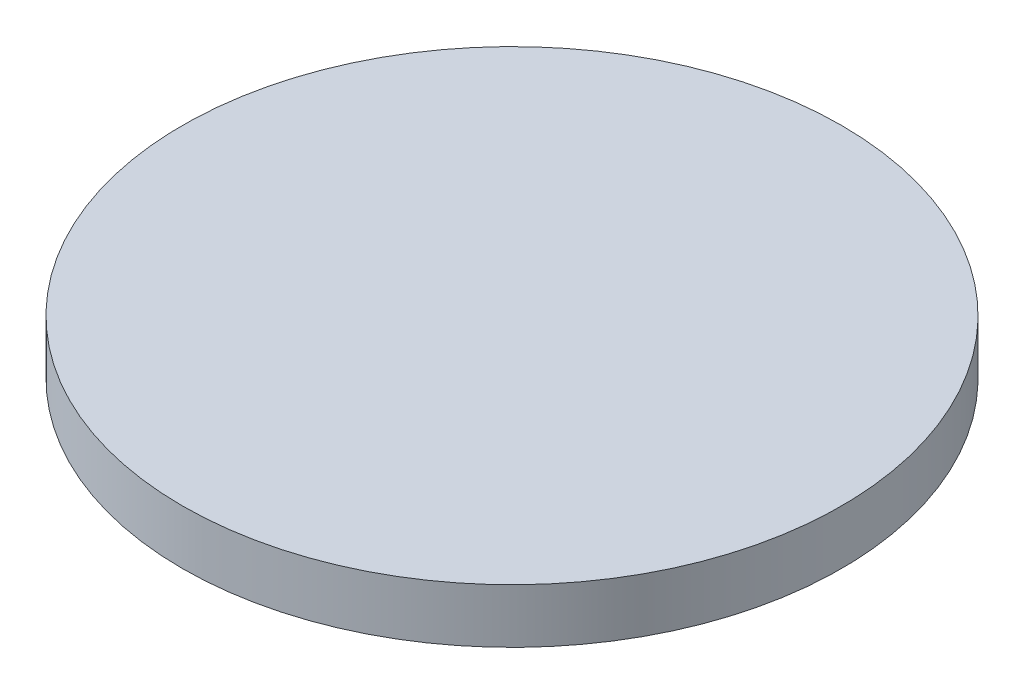
ISO-10303-21;
HEADER;
FILE_DESCRIPTION(('STEP AP214'),'2;1');
FILE_NAME('part.step','',(''),(''),'','','');
FILE_SCHEMA(('AUTOMOTIVE_DESIGN { 1 0 10303 214 1 1 1 1 }'));
ENDSEC;
DATA;
#1=APPLICATION_CONTEXT('core data for automotive mechanical design processes');
#2=APPLICATION_PROTOCOL_DEFINITION('international standard','automotive_design',2000,#1);
#3=PRODUCT_CONTEXT('',#1,'mechanical');
#4=PRODUCT('Part','Part','',(#3));
#5=PRODUCT_RELATED_PRODUCT_CATEGORY('part','',(#4));
#6=PRODUCT_DEFINITION_FORMATION('','',#4);
#7=PRODUCT_DEFINITION_CONTEXT('part definition',#1,'design');
#8=PRODUCT_DEFINITION('design','',#6,#7);
#9=PRODUCT_DEFINITION_SHAPE('','',#8);
#10=(LENGTH_UNIT() NAMED_UNIT(*) SI_UNIT(.MILLI.,.METRE.));
#11=(NAMED_UNIT(*) PLANE_ANGLE_UNIT() SI_UNIT($,.RADIAN.));
#12=(NAMED_UNIT(*) SI_UNIT($,.STERADIAN.) SOLID_ANGLE_UNIT());
#13=UNCERTAINTY_MEASURE_WITH_UNIT(LENGTH_MEASURE(1.E-05),#10,'distance_accuracy_value','');
#14=(GEOMETRIC_REPRESENTATION_CONTEXT(3) GLOBAL_UNCERTAINTY_ASSIGNED_CONTEXT((#13)) GLOBAL_UNIT_ASSIGNED_CONTEXT((#10,
#11,#12)) REPRESENTATION_CONTEXT('',''));
#15=CARTESIAN_POINT('',(0.,0.,0.));
#16=DIRECTION('',(0.,0.,1.));
#17=DIRECTION('',(1.,0.,0.));
#18=AXIS2_PLACEMENT_3D('',#15,#16,#17);
#19=CARTESIAN_POINT('',(0.,1.4,0.));
#20=DIRECTION('',(0.,-1.,0.));
#21=DIRECTION('',(0.,0.,-1.));
#22=AXIS2_PLACEMENT_3D('',#19,#20,#21);
#23=CYLINDRICAL_SURFACE('',#22,8.5);
#24=CARTESIAN_POINT('',(0.,1.4,0.));
#25=DIRECTION('',(0.,1.,0.));
#26=DIRECTION('',(0.,0.,1.));
#27=AXIS2_PLACEMENT_3D('',#24,#25,#26);
#28=CIRCLE('',#27,8.5);
#29=CARTESIAN_POINT('',(0.,1.4,8.5));
#30=VERTEX_POINT('',#29);
#31=EDGE_CURVE('E10',#30,#30,#28,.T.);
#32=ORIENTED_EDGE('',*,*,#31,.F.);
#33=EDGE_LOOP('',(#32));
#34=FACE_BOUND('',#33,.T.);
#35=CARTESIAN_POINT('',(0.,0.,0.));
#36=DIRECTION('',(0.,1.,0.));
#37=DIRECTION('',(0.,0.,1.));
#38=AXIS2_PLACEMENT_3D('',#35,#36,#37);
#39=CIRCLE('',#38,8.5);
#40=CARTESIAN_POINT('',(0.,0.,8.5));
#41=VERTEX_POINT('',#40);
#42=EDGE_CURVE('E40',#41,#41,#39,.T.);
#43=ORIENTED_EDGE('',*,*,#42,.T.);
#44=EDGE_LOOP('',(#43));
#45=FACE_BOUND('',#44,.T.);
#46=ADVANCED_FACE('F37',(#34,#45),#23,.T.);
#47=CARTESIAN_POINT('',(0.,1.4,0.));
#48=DIRECTION('',(0.,1.,0.));
#49=DIRECTION('',(0.,0.,1.));
#50=AXIS2_PLACEMENT_3D('',#47,#48,#49);
#51=PLANE('',#50);
#52=ORIENTED_EDGE('',*,*,#31,.T.);
#53=EDGE_LOOP('',(#52));
#54=FACE_BOUND('',#53,.T.);
#55=ADVANCED_FACE('F52',(#54),#51,.T.);
#56=CARTESIAN_POINT('',(0.,0.,0.));
#57=DIRECTION('',(0.,1.,0.));
#58=DIRECTION('',(0.,0.,1.));
#59=AXIS2_PLACEMENT_3D('',#56,#57,#58);
#60=PLANE('',#59);
#61=ORIENTED_EDGE('',*,*,#42,.F.);
#62=EDGE_LOOP('',(#61));
#63=FACE_BOUND('',#62,.T.);
#64=ADVANCED_FACE('F50',(#63),#60,.F.);
#65=CLOSED_SHELL('',(#46,#55,#64));
#66=MANIFOLD_SOLID_BREP('B2',#65);
#67=ADVANCED_BREP_SHAPE_REPRESENTATION('',(#18,#66),#14);
#68=SHAPE_DEFINITION_REPRESENTATION(#9,#67);
ENDSEC;
END-ISO-10303-21;
